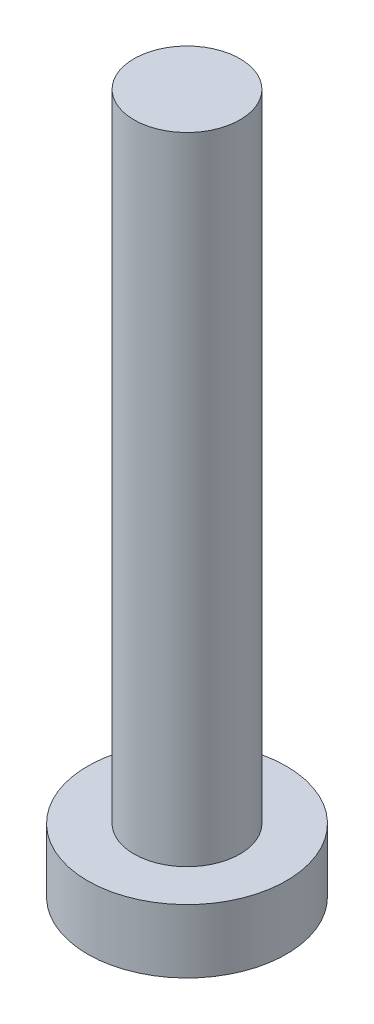
ISO-10303-21;
HEADER;
FILE_DESCRIPTION(('STEP AP214'),'2;1');
FILE_NAME('part.step','',(''),(''),'','','');
FILE_SCHEMA(('AUTOMOTIVE_DESIGN { 1 0 10303 214 1 1 1 1 }'));
ENDSEC;
DATA;
#1=APPLICATION_CONTEXT('core data for automotive mechanical design processes');
#2=APPLICATION_PROTOCOL_DEFINITION('international standard','automotive_design',2000,#1);
#3=PRODUCT_CONTEXT('',#1,'mechanical');
#4=PRODUCT('Part','Part','',(#3));
#5=PRODUCT_RELATED_PRODUCT_CATEGORY('part','',(#4));
#6=PRODUCT_DEFINITION_FORMATION('','',#4);
#7=PRODUCT_DEFINITION_CONTEXT('part definition',#1,'design');
#8=PRODUCT_DEFINITION('design','',#6,#7);
#9=PRODUCT_DEFINITION_SHAPE('','',#8);
#10=(LENGTH_UNIT() NAMED_UNIT(*) SI_UNIT(.MILLI.,.METRE.));
#11=(NAMED_UNIT(*) PLANE_ANGLE_UNIT() SI_UNIT($,.RADIAN.));
#12=(NAMED_UNIT(*) SI_UNIT($,.STERADIAN.) SOLID_ANGLE_UNIT());
#13=UNCERTAINTY_MEASURE_WITH_UNIT(LENGTH_MEASURE(1.E-05),#10,'distance_accuracy_value','');
#14=(GEOMETRIC_REPRESENTATION_CONTEXT(3) GLOBAL_UNCERTAINTY_ASSIGNED_CONTEXT((#13)) GLOBAL_UNIT_ASSIGNED_CONTEXT((#10,
#11,#12)) REPRESENTATION_CONTEXT('',''));
#15=CARTESIAN_POINT('',(0.,0.,0.));
#16=DIRECTION('',(0.,0.,1.));
#17=DIRECTION('',(1.,0.,0.));
#18=AXIS2_PLACEMENT_3D('',#15,#16,#17);
#19=CARTESIAN_POINT('',(0.,1.2,0.));
#20=DIRECTION('',(0.,1.,0.));
#21=DIRECTION('',(0.,0.,1.));
#22=AXIS2_PLACEMENT_3D('',#19,#20,#21);
#23=PLANE('',#22);
#24=CARTESIAN_POINT('',(0.,1.2,0.));
#25=DIRECTION('',(0.,1.,0.));
#26=DIRECTION('',(0.,0.,1.));
#27=AXIS2_PLACEMENT_3D('',#24,#25,#26);
#28=CIRCLE('',#27,1.);
#29=CARTESIAN_POINT('',(0.,1.2,1.));
#30=VERTEX_POINT('',#29);
#31=EDGE_CURVE('E184',#30,#30,#28,.T.);
#32=ORIENTED_EDGE('',*,*,#31,.F.);
#33=EDGE_LOOP('',(#32));
#34=FACE_BOUND('',#33,.T.);
#35=CARTESIAN_POINT('',(0.,1.2,0.));
#36=DIRECTION('',(0.,1.,0.));
#37=DIRECTION('',(0.,0.,1.));
#38=AXIS2_PLACEMENT_3D('',#35,#36,#37);
#39=CIRCLE('',#38,1.875);
#40=CARTESIAN_POINT('',(0.,1.2,1.875));
#41=VERTEX_POINT('',#40);
#42=EDGE_CURVE('E11',#41,#41,#39,.T.);
#43=ORIENTED_EDGE('',*,*,#42,.T.);
#44=EDGE_LOOP('',(#43));
#45=FACE_BOUND('',#44,.T.);
#46=ADVANCED_FACE('F47',(#34,#45),#23,.T.);
#47=CARTESIAN_POINT('',(0.,0.,0.));
#48=DIRECTION('',(0.,1.,0.));
#49=DIRECTION('',(0.,0.,1.));
#50=AXIS2_PLACEMENT_3D('',#47,#48,#49);
#51=PLANE('',#50);
#52=CARTESIAN_POINT('',(0.,0.,0.));
#53=DIRECTION('',(0.,1.,0.));
#54=DIRECTION('',(0.,0.,1.));
#55=AXIS2_PLACEMENT_3D('',#52,#53,#54);
#56=CIRCLE('',#55,1.875);
#57=CARTESIAN_POINT('',(0.,0.,1.875));
#58=VERTEX_POINT('',#57);
#59=EDGE_CURVE('E51',#58,#58,#56,.T.);
#60=ORIENTED_EDGE('',*,*,#59,.F.);
#61=EDGE_LOOP('',(#60));
#62=FACE_BOUND('',#61,.T.);
#63=DIRECTION('',(0.5,0.,-0.866025403784439));
#64=VECTOR('',#63,1.);
#65=CARTESIAN_POINT('',(0.433012701892219,0.,0.75));
#66=LINE('',#65,#64);
#67=CARTESIAN_POINT('',(0.433012701892219,0.,0.75));
#68=VERTEX_POINT('',#67);
#69=CARTESIAN_POINT('',(0.866025403784439,0.,0.));
#70=VERTEX_POINT('',#69);
#71=EDGE_CURVE('E62',#68,#70,#66,.T.);
#72=ORIENTED_EDGE('',*,*,#71,.T.);
#73=DIRECTION('',(-0.5,0.,-0.866025403784439));
#74=VECTOR('',#73,1.);
#75=CARTESIAN_POINT('',(0.866025403784439,0.,0.));
#76=LINE('',#75,#74);
#77=CARTESIAN_POINT('',(0.433012701892219,0.,-0.75));
#78=VERTEX_POINT('',#77);
#79=EDGE_CURVE('E122',#70,#78,#76,.T.);
#80=ORIENTED_EDGE('',*,*,#79,.T.);
#81=DIRECTION('',(-1.,0.,0.));
#82=VECTOR('',#81,1.);
#83=CARTESIAN_POINT('',(0.433012701892219,0.,-0.75));
#84=LINE('',#83,#82);
#85=CARTESIAN_POINT('',(-0.43301270189222,0.,-0.75));
#86=VERTEX_POINT('',#85);
#87=EDGE_CURVE('E120',#78,#86,#84,.T.);
#88=ORIENTED_EDGE('',*,*,#87,.T.);
#89=DIRECTION('',(-0.5,0.,0.866025403784439));
#90=VECTOR('',#89,1.);
#91=CARTESIAN_POINT('',(-0.43301270189222,0.,-0.75));
#92=LINE('',#91,#90);
#93=CARTESIAN_POINT('',(-0.866025403784439,0.,0.));
#94=VERTEX_POINT('',#93);
#95=EDGE_CURVE('E98',#86,#94,#92,.T.);
#96=ORIENTED_EDGE('',*,*,#95,.T.);
#97=DIRECTION('',(0.5,0.,0.866025403784439));
#98=VECTOR('',#97,1.);
#99=CARTESIAN_POINT('',(-0.866025403784439,0.,0.));
#100=LINE('',#99,#98);
#101=CARTESIAN_POINT('',(-0.433012701892219,0.,0.75));
#102=VERTEX_POINT('',#101);
#103=EDGE_CURVE('E109',#94,#102,#100,.T.);
#104=ORIENTED_EDGE('',*,*,#103,.T.);
#105=DIRECTION('',(1.,0.,0.));
#106=VECTOR('',#105,1.);
#107=CARTESIAN_POINT('',(-0.433012701892219,0.,0.75));
#108=LINE('',#107,#106);
#109=EDGE_CURVE('E115',#102,#68,#108,.T.);
#110=ORIENTED_EDGE('',*,*,#109,.T.);
#111=EDGE_LOOP('',(#72,#80,#88,#96,#104,#110));
#112=FACE_BOUND('',#111,.T.);
#113=ADVANCED_FACE('F117',(#62,#112),#51,.F.);
#114=CARTESIAN_POINT('',(0.,1.2,0.));
#115=DIRECTION('',(0.,-1.,0.));
#116=DIRECTION('',(0.,0.,-1.));
#117=AXIS2_PLACEMENT_3D('',#114,#115,#116);
#118=CYLINDRICAL_SURFACE('',#117,1.875);
#119=ORIENTED_EDGE('',*,*,#42,.F.);
#120=EDGE_LOOP('',(#119));
#121=FACE_BOUND('',#120,.T.);
#122=ORIENTED_EDGE('',*,*,#59,.T.);
#123=EDGE_LOOP('',(#122));
#124=FACE_BOUND('',#123,.T.);
#125=ADVANCED_FACE('F49',(#121,#124),#118,.T.);
#126=CARTESIAN_POINT('',(0.433012701892219,1.2,0.75));
#127=DIRECTION('',(-0.866025403784439,0.,-0.5));
#128=DIRECTION('',(-0.5,0.,0.866025403784439));
#129=AXIS2_PLACEMENT_3D('',#126,#127,#128);
#130=PLANE('',#129);
#131=ORIENTED_EDGE('',*,*,#71,.F.);
#132=DIRECTION('',(0.,-1.,0.));
#133=VECTOR('',#132,1.);
#134=CARTESIAN_POINT('',(0.433012701892219,1.2,0.75));
#135=LINE('',#134,#133);
#136=CARTESIAN_POINT('',(0.433012701892219,1.2,0.75));
#137=VERTEX_POINT('',#136);
#138=EDGE_CURVE('E127',#137,#68,#135,.T.);
#139=ORIENTED_EDGE('',*,*,#138,.F.);
#140=DIRECTION('',(0.5,0.,-0.866025403784439));
#141=VECTOR('',#140,1.);
#142=CARTESIAN_POINT('',(0.433012701892219,1.2,0.75));
#143=LINE('',#142,#141);
#144=CARTESIAN_POINT('',(0.866025403784439,1.2,0.));
#145=VERTEX_POINT('',#144);
#146=EDGE_CURVE('E71',#137,#145,#143,.T.);
#147=ORIENTED_EDGE('',*,*,#146,.T.);
#148=DIRECTION('',(0.,-1.,0.));
#149=VECTOR('',#148,1.);
#150=CARTESIAN_POINT('',(0.866025403784439,1.2,0.));
#151=LINE('',#150,#149);
#152=EDGE_CURVE('E134',#145,#70,#151,.T.);
#153=ORIENTED_EDGE('',*,*,#152,.T.);
#154=EDGE_LOOP('',(#131,#139,#147,#153));
#155=FACE_BOUND('',#154,.T.);
#156=ADVANCED_FACE('F144',(#155),#130,.T.);
#157=CARTESIAN_POINT('',(0.866025403784439,1.2,0.));
#158=DIRECTION('',(-0.866025403784439,0.,0.5));
#159=DIRECTION('',(0.5,0.,0.866025403784439));
#160=AXIS2_PLACEMENT_3D('',#157,#158,#159);
#161=PLANE('',#160);
#162=ORIENTED_EDGE('',*,*,#79,.F.);
#163=ORIENTED_EDGE('',*,*,#152,.F.);
#164=DIRECTION('',(-0.5,0.,-0.866025403784439));
#165=VECTOR('',#164,1.);
#166=CARTESIAN_POINT('',(0.866025403784439,1.2,0.));
#167=LINE('',#166,#165);
#168=CARTESIAN_POINT('',(0.433012701892219,1.2,-0.75));
#169=VERTEX_POINT('',#168);
#170=EDGE_CURVE('E191',#145,#169,#167,.T.);
#171=ORIENTED_EDGE('',*,*,#170,.T.);
#172=DIRECTION('',(0.,-1.,0.));
#173=VECTOR('',#172,1.);
#174=CARTESIAN_POINT('',(0.433012701892219,1.2,-0.75));
#175=LINE('',#174,#173);
#176=EDGE_CURVE('E132',#169,#78,#175,.T.);
#177=ORIENTED_EDGE('',*,*,#176,.T.);
#178=EDGE_LOOP('',(#162,#163,#171,#177));
#179=FACE_BOUND('',#178,.T.);
#180=ADVANCED_FACE('F152',(#179),#161,.T.);
#181=CARTESIAN_POINT('',(0.433012701892219,1.2,-0.75));
#182=DIRECTION('',(0.,0.,1.));
#183=DIRECTION('',(1.,0.,0.));
#184=AXIS2_PLACEMENT_3D('',#181,#182,#183);
#185=PLANE('',#184);
#186=ORIENTED_EDGE('',*,*,#87,.F.);
#187=ORIENTED_EDGE('',*,*,#176,.F.);
#188=DIRECTION('',(-1.,0.,0.));
#189=VECTOR('',#188,1.);
#190=CARTESIAN_POINT('',(0.433012701892219,1.2,-0.75));
#191=LINE('',#190,#189);
#192=CARTESIAN_POINT('',(-0.43301270189222,1.2,-0.75));
#193=VERTEX_POINT('',#192);
#194=EDGE_CURVE('E194',#169,#193,#191,.T.);
#195=ORIENTED_EDGE('',*,*,#194,.T.);
#196=DIRECTION('',(0.,-1.,0.));
#197=VECTOR('',#196,1.);
#198=CARTESIAN_POINT('',(-0.43301270189222,1.2,-0.75));
#199=LINE('',#198,#197);
#200=EDGE_CURVE('E105',#193,#86,#199,.T.);
#201=ORIENTED_EDGE('',*,*,#200,.T.);
#202=EDGE_LOOP('',(#186,#187,#195,#201));
#203=FACE_BOUND('',#202,.T.);
#204=ADVANCED_FACE('F155',(#203),#185,.T.);
#205=CARTESIAN_POINT('',(-0.43301270189222,1.2,-0.75));
#206=DIRECTION('',(0.866025403784439,0.,0.5));
#207=DIRECTION('',(0.5,0.,-0.866025403784439));
#208=AXIS2_PLACEMENT_3D('',#205,#206,#207);
#209=PLANE('',#208);
#210=ORIENTED_EDGE('',*,*,#95,.F.);
#211=ORIENTED_EDGE('',*,*,#200,.F.);
#212=DIRECTION('',(-0.5,0.,0.866025403784439));
#213=VECTOR('',#212,1.);
#214=CARTESIAN_POINT('',(-0.43301270189222,1.2,-0.75));
#215=LINE('',#214,#213);
#216=CARTESIAN_POINT('',(-0.866025403784439,1.2,0.));
#217=VERTEX_POINT('',#216);
#218=EDGE_CURVE('E102',#193,#217,#215,.T.);
#219=ORIENTED_EDGE('',*,*,#218,.T.);
#220=DIRECTION('',(0.,-1.,0.));
#221=VECTOR('',#220,1.);
#222=CARTESIAN_POINT('',(-0.866025403784439,1.2,0.));
#223=LINE('',#222,#221);
#224=EDGE_CURVE('E93',#217,#94,#223,.T.);
#225=ORIENTED_EDGE('',*,*,#224,.T.);
#226=EDGE_LOOP('',(#210,#211,#219,#225));
#227=FACE_BOUND('',#226,.T.);
#228=ADVANCED_FACE('F95',(#227),#209,.T.);
#229=CARTESIAN_POINT('',(-0.866025403784439,1.2,0.));
#230=DIRECTION('',(0.866025403784439,0.,-0.5));
#231=DIRECTION('',(-0.5,0.,-0.866025403784439));
#232=AXIS2_PLACEMENT_3D('',#229,#230,#231);
#233=PLANE('',#232);
#234=ORIENTED_EDGE('',*,*,#103,.F.);
#235=ORIENTED_EDGE('',*,*,#224,.F.);
#236=DIRECTION('',(0.5,0.,0.866025403784439));
#237=VECTOR('',#236,1.);
#238=CARTESIAN_POINT('',(-0.866025403784439,1.2,0.));
#239=LINE('',#238,#237);
#240=CARTESIAN_POINT('',(-0.433012701892219,1.2,0.75));
#241=VERTEX_POINT('',#240);
#242=EDGE_CURVE('E198',#217,#241,#239,.T.);
#243=ORIENTED_EDGE('',*,*,#242,.T.);
#244=DIRECTION('',(0.,-1.,0.));
#245=VECTOR('',#244,1.);
#246=CARTESIAN_POINT('',(-0.433012701892219,1.2,0.75));
#247=LINE('',#246,#245);
#248=EDGE_CURVE('E106',#241,#102,#247,.T.);
#249=ORIENTED_EDGE('',*,*,#248,.T.);
#250=EDGE_LOOP('',(#234,#235,#243,#249));
#251=FACE_BOUND('',#250,.T.);
#252=ADVANCED_FACE('F110',(#251),#233,.T.);
#253=CARTESIAN_POINT('',(-0.433012701892219,1.2,0.75));
#254=DIRECTION('',(0.,0.,-1.));
#255=DIRECTION('',(-1.,0.,0.));
#256=AXIS2_PLACEMENT_3D('',#253,#254,#255);
#257=PLANE('',#256);
#258=ORIENTED_EDGE('',*,*,#109,.F.);
#259=ORIENTED_EDGE('',*,*,#248,.F.);
#260=DIRECTION('',(1.,0.,0.));
#261=VECTOR('',#260,1.);
#262=CARTESIAN_POINT('',(-0.433012701892219,1.2,0.75));
#263=LINE('',#262,#261);
#264=EDGE_CURVE('E129',#241,#137,#263,.T.);
#265=ORIENTED_EDGE('',*,*,#264,.T.);
#266=ORIENTED_EDGE('',*,*,#138,.T.);
#267=EDGE_LOOP('',(#258,#259,#265,#266));
#268=FACE_BOUND('',#267,.T.);
#269=ADVANCED_FACE('F164',(#268),#257,.T.);
#270=CARTESIAN_POINT('',(0.,1.2,0.));
#271=DIRECTION('',(0.,1.,0.));
#272=DIRECTION('',(0.,0.,1.));
#273=AXIS2_PLACEMENT_3D('',#270,#271,#272);
#274=PLANE('',#273);
#275=ORIENTED_EDGE('',*,*,#146,.F.);
#276=ORIENTED_EDGE('',*,*,#264,.F.);
#277=ORIENTED_EDGE('',*,*,#242,.F.);
#278=ORIENTED_EDGE('',*,*,#218,.F.);
#279=ORIENTED_EDGE('',*,*,#194,.F.);
#280=ORIENTED_EDGE('',*,*,#170,.F.);
#281=EDGE_LOOP('',(#275,#276,#277,#278,#279,#280));
#282=FACE_BOUND('',#281,.T.);
#283=ADVANCED_FACE('F167',(#282),#274,.F.);
#284=CARTESIAN_POINT('',(0.,13.2,0.));
#285=DIRECTION('',(0.,-1.,0.));
#286=DIRECTION('',(0.,0.,-1.));
#287=AXIS2_PLACEMENT_3D('',#284,#285,#286);
#288=CYLINDRICAL_SURFACE('',#287,1.);
#289=CARTESIAN_POINT('',(0.,13.2,0.));
#290=DIRECTION('',(0.,1.,0.));
#291=DIRECTION('',(0.,0.,1.));
#292=AXIS2_PLACEMENT_3D('',#289,#290,#291);
#293=CIRCLE('',#292,1.);
#294=CARTESIAN_POINT('',(0.,13.2,1.));
#295=VERTEX_POINT('',#294);
#296=EDGE_CURVE('E183',#295,#295,#293,.T.);
#297=ORIENTED_EDGE('',*,*,#296,.F.);
#298=EDGE_LOOP('',(#297));
#299=FACE_BOUND('',#298,.T.);
#300=ORIENTED_EDGE('',*,*,#31,.T.);
#301=EDGE_LOOP('',(#300));
#302=FACE_BOUND('',#301,.T.);
#303=ADVANCED_FACE('F169',(#299,#302),#288,.T.);
#304=CARTESIAN_POINT('',(0.,13.2,0.));
#305=DIRECTION('',(0.,1.,0.));
#306=DIRECTION('',(0.,0.,1.));
#307=AXIS2_PLACEMENT_3D('',#304,#305,#306);
#308=PLANE('',#307);
#309=ORIENTED_EDGE('',*,*,#296,.T.);
#310=EDGE_LOOP('',(#309));
#311=FACE_BOUND('',#310,.T.);
#312=ADVANCED_FACE('F172',(#311),#308,.T.);
#313=CLOSED_SHELL('',(#46,#113,#125,#156,#180,#204,#228,#252,#269,#283,#303,#312));
#314=MANIFOLD_SOLID_BREP('B2',#313);
#315=ADVANCED_BREP_SHAPE_REPRESENTATION('',(#18,#314),#14);
#316=SHAPE_DEFINITION_REPRESENTATION(#9,#315);
ENDSEC;
END-ISO-10303-21;
